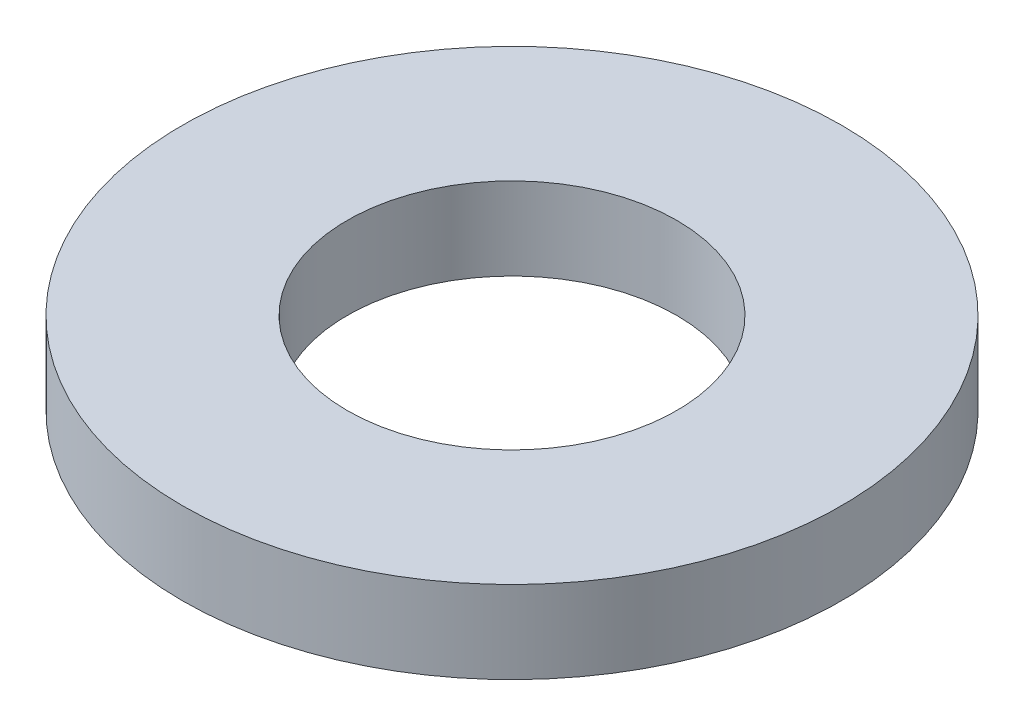
ISO-10303-21;
HEADER;
FILE_DESCRIPTION(('STEP AP214'),'2;1');
FILE_NAME('part.step','',(''),(''),'','','');
FILE_SCHEMA(('AUTOMOTIVE_DESIGN { 1 0 10303 214 1 1 1 1 }'));
ENDSEC;
DATA;
#1=APPLICATION_CONTEXT('core data for automotive mechanical design processes');
#2=APPLICATION_PROTOCOL_DEFINITION('international standard','automotive_design',2000,#1);
#3=PRODUCT_CONTEXT('',#1,'mechanical');
#4=PRODUCT('Part','Part','',(#3));
#5=PRODUCT_RELATED_PRODUCT_CATEGORY('part','',(#4));
#6=PRODUCT_DEFINITION_FORMATION('','',#4);
#7=PRODUCT_DEFINITION_CONTEXT('part definition',#1,'design');
#8=PRODUCT_DEFINITION('design','',#6,#7);
#9=PRODUCT_DEFINITION_SHAPE('','',#8);
#10=(LENGTH_UNIT() NAMED_UNIT(*) SI_UNIT(.MILLI.,.METRE.));
#11=(NAMED_UNIT(*) PLANE_ANGLE_UNIT() SI_UNIT($,.RADIAN.));
#12=(NAMED_UNIT(*) SI_UNIT($,.STERADIAN.) SOLID_ANGLE_UNIT());
#13=UNCERTAINTY_MEASURE_WITH_UNIT(LENGTH_MEASURE(1.E-05),#10,'distance_accuracy_value','');
#14=(GEOMETRIC_REPRESENTATION_CONTEXT(3) GLOBAL_UNCERTAINTY_ASSIGNED_CONTEXT((#13)) GLOBAL_UNIT_ASSIGNED_CONTEXT((#10,
#11,#12)) REPRESENTATION_CONTEXT('',''));
#15=CARTESIAN_POINT('',(0.,0.,0.));
#16=DIRECTION('',(0.,0.,1.));
#17=DIRECTION('',(1.,0.,0.));
#18=AXIS2_PLACEMENT_3D('',#15,#16,#17);
#19=CARTESIAN_POINT('',(0.,1.5,0.));
#20=DIRECTION('',(0.,1.,0.));
#21=DIRECTION('',(0.,0.,1.));
#22=AXIS2_PLACEMENT_3D('',#19,#20,#21);
#23=PLANE('',#22);
#24=CARTESIAN_POINT('',(0.,1.5,0.));
#25=DIRECTION('',(0.,1.,0.));
#26=DIRECTION('',(0.,0.,1.));
#27=AXIS2_PLACEMENT_3D('',#24,#25,#26);
#28=CIRCLE('',#27,6.);
#29=CARTESIAN_POINT('',(0.,1.5,6.));
#30=VERTEX_POINT('',#29);
#31=EDGE_CURVE('E10',#30,#30,#28,.T.);
#32=ORIENTED_EDGE('',*,*,#31,.T.);
#33=EDGE_LOOP('',(#32));
#34=FACE_BOUND('',#33,.T.);
#35=CARTESIAN_POINT('',(0.,1.5,0.));
#36=DIRECTION('',(0.,1.,0.));
#37=DIRECTION('',(0.,0.,1.));
#38=AXIS2_PLACEMENT_3D('',#35,#36,#37);
#39=CIRCLE('',#38,3.);
#40=CARTESIAN_POINT('',(0.,1.5,3.));
#41=VERTEX_POINT('',#40);
#42=EDGE_CURVE('E50',#41,#41,#39,.T.);
#43=ORIENTED_EDGE('',*,*,#42,.F.);
#44=EDGE_LOOP('',(#43));
#45=FACE_BOUND('',#44,.T.);
#46=ADVANCED_FACE('F37',(#34,#45),#23,.T.);
#47=CARTESIAN_POINT('',(0.,0.,0.));
#48=DIRECTION('',(0.,1.,0.));
#49=DIRECTION('',(0.,0.,1.));
#50=AXIS2_PLACEMENT_3D('',#47,#48,#49);
#51=PLANE('',#50);
#52=CARTESIAN_POINT('',(0.,0.,0.));
#53=DIRECTION('',(0.,1.,0.));
#54=DIRECTION('',(0.,0.,1.));
#55=AXIS2_PLACEMENT_3D('',#52,#53,#54);
#56=CIRCLE('',#55,6.);
#57=CARTESIAN_POINT('',(0.,0.,6.));
#58=VERTEX_POINT('',#57);
#59=EDGE_CURVE('E41',#58,#58,#56,.T.);
#60=ORIENTED_EDGE('',*,*,#59,.F.);
#61=EDGE_LOOP('',(#60));
#62=FACE_BOUND('',#61,.T.);
#63=CARTESIAN_POINT('',(0.,0.,0.));
#64=DIRECTION('',(0.,1.,0.));
#65=DIRECTION('',(0.,0.,1.));
#66=AXIS2_PLACEMENT_3D('',#63,#64,#65);
#67=CIRCLE('',#66,3.);
#68=CARTESIAN_POINT('',(0.,0.,3.));
#69=VERTEX_POINT('',#68);
#70=EDGE_CURVE('E52',#69,#69,#67,.T.);
#71=ORIENTED_EDGE('',*,*,#70,.T.);
#72=EDGE_LOOP('',(#71));
#73=FACE_BOUND('',#72,.T.);
#74=ADVANCED_FACE('F64',(#62,#73),#51,.F.);
#75=CARTESIAN_POINT('',(0.,1.5,0.));
#76=DIRECTION('',(0.,-1.,0.));
#77=DIRECTION('',(0.,0.,-1.));
#78=AXIS2_PLACEMENT_3D('',#75,#76,#77);
#79=CYLINDRICAL_SURFACE('',#78,6.);
#80=ORIENTED_EDGE('',*,*,#31,.F.);
#81=EDGE_LOOP('',(#80));
#82=FACE_BOUND('',#81,.T.);
#83=ORIENTED_EDGE('',*,*,#59,.T.);
#84=EDGE_LOOP('',(#83));
#85=FACE_BOUND('',#84,.T.);
#86=ADVANCED_FACE('F39',(#82,#85),#79,.T.);
#87=CARTESIAN_POINT('',(0.,1.5,0.));
#88=DIRECTION('',(0.,-1.,0.));
#89=DIRECTION('',(0.,0.,-1.));
#90=AXIS2_PLACEMENT_3D('',#87,#88,#89);
#91=CYLINDRICAL_SURFACE('',#90,3.);
#92=ORIENTED_EDGE('',*,*,#42,.T.);
#93=EDGE_LOOP('',(#92));
#94=FACE_BOUND('',#93,.T.);
#95=ORIENTED_EDGE('',*,*,#70,.F.);
#96=EDGE_LOOP('',(#95));
#97=FACE_BOUND('',#96,.T.);
#98=ADVANCED_FACE('F60',(#94,#97),#91,.F.);
#99=CLOSED_SHELL('',(#46,#74,#86,#98));
#100=MANIFOLD_SOLID_BREP('B2',#99);
#101=ADVANCED_BREP_SHAPE_REPRESENTATION('',(#18,#100),#14);
#102=SHAPE_DEFINITION_REPRESENTATION(#9,#101);
ENDSEC;
END-ISO-10303-21;
